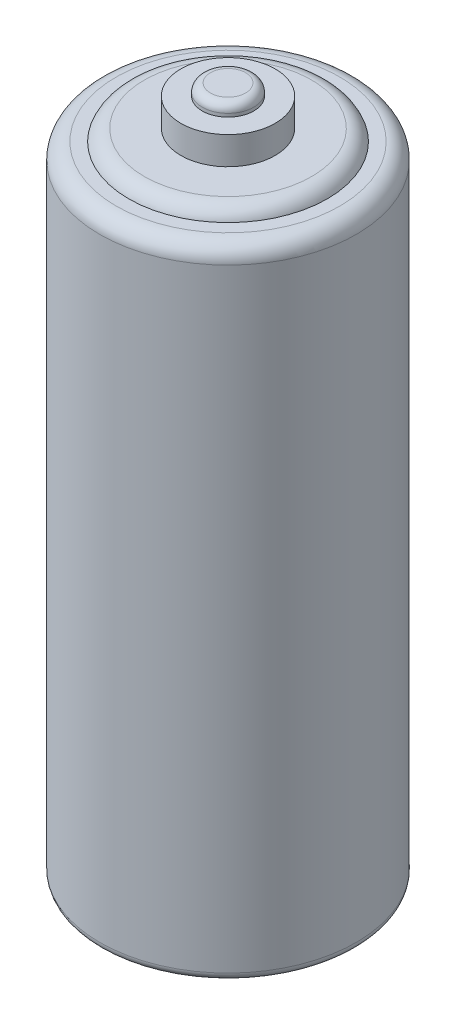
ISO-10303-21;
HEADER;
FILE_DESCRIPTION(('STEP AP214'),'2;1');
FILE_NAME('part.step','',(''),(''),'','','');
FILE_SCHEMA(('AUTOMOTIVE_DESIGN { 1 0 10303 214 1 1 1 1 }'));
ENDSEC;
DATA;
#1=APPLICATION_CONTEXT('core data for automotive mechanical design processes');
#2=APPLICATION_PROTOCOL_DEFINITION('international standard','automotive_design',2000,#1);
#3=PRODUCT_CONTEXT('',#1,'mechanical');
#4=PRODUCT('Part','Part','',(#3));
#5=PRODUCT_RELATED_PRODUCT_CATEGORY('part','',(#4));
#6=PRODUCT_DEFINITION_FORMATION('','',#4);
#7=PRODUCT_DEFINITION_CONTEXT('part definition',#1,'design');
#8=PRODUCT_DEFINITION('design','',#6,#7);
#9=PRODUCT_DEFINITION_SHAPE('','',#8);
#10=(LENGTH_UNIT() NAMED_UNIT(*) SI_UNIT(.MILLI.,.METRE.));
#11=(NAMED_UNIT(*) PLANE_ANGLE_UNIT() SI_UNIT($,.RADIAN.));
#12=(NAMED_UNIT(*) SI_UNIT($,.STERADIAN.) SOLID_ANGLE_UNIT());
#13=UNCERTAINTY_MEASURE_WITH_UNIT(LENGTH_MEASURE(1.E-05),#10,'distance_accuracy_value','');
#14=(GEOMETRIC_REPRESENTATION_CONTEXT(3) GLOBAL_UNCERTAINTY_ASSIGNED_CONTEXT((#13)) GLOBAL_UNIT_ASSIGNED_CONTEXT((#10,
#11,#12)) REPRESENTATION_CONTEXT('',''));
#15=CARTESIAN_POINT('',(0.,0.,0.));
#16=DIRECTION('',(0.,0.,1.));
#17=DIRECTION('',(1.,0.,0.));
#18=AXIS2_PLACEMENT_3D('',#15,#16,#17);
#19=CARTESIAN_POINT('',(-7.36746646919898,38.9,-0.770235130870801));
#20=DIRECTION('',(0.,-1.,0.));
#21=DIRECTION('',(0.,0.,-1.));
#22=AXIS2_PLACEMENT_3D('',#19,#20,#21);
#23=CYLINDRICAL_SURFACE('',#22,7.8222997425254);
#24=CARTESIAN_POINT('',(-7.36746646919898,0.5,-0.770235130870801));
#25=DIRECTION('',(0.,1.,0.));
#26=DIRECTION('',(0.,0.,1.));
#27=AXIS2_PLACEMENT_3D('',#24,#25,#26);
#28=CIRCLE('',#27,7.8222997425254);
#29=CARTESIAN_POINT('',(-7.36746646919898,0.5,7.0520646116546));
#30=VERTEX_POINT('',#29);
#31=EDGE_CURVE('E63',#30,#30,#28,.T.);
#32=ORIENTED_EDGE('',*,*,#31,.T.);
#33=EDGE_LOOP('',(#32));
#34=FACE_BOUND('',#33,.T.);
#35=CARTESIAN_POINT('',(-7.36746646919898,37.9,-0.770235130870801));
#36=DIRECTION('',(0.,1.,0.));
#37=DIRECTION('',(0.,0.,1.));
#38=AXIS2_PLACEMENT_3D('',#35,#36,#37);
#39=CIRCLE('',#38,7.8222997425254);
#40=CARTESIAN_POINT('',(-7.36746646919898,37.9,7.0520646116546));
#41=VERTEX_POINT('',#40);
#42=EDGE_CURVE('E79',#41,#41,#39,.F.);
#43=ORIENTED_EDGE('',*,*,#42,.T.);
#44=EDGE_LOOP('',(#43));
#45=FACE_BOUND('',#44,.T.);
#46=ADVANCED_FACE('F48',(#34,#45),#23,.T.);
#47=CARTESIAN_POINT('',(-7.36746646919898,38.9,-0.770235130870801));
#48=DIRECTION('',(0.,1.,0.));
#49=DIRECTION('',(0.,0.,1.));
#50=AXIS2_PLACEMENT_3D('',#47,#48,#49);
#51=PLANE('',#50);
#52=CARTESIAN_POINT('',(-7.36746646919898,38.9,-0.770235130870801));
#53=DIRECTION('',(0.,1.,0.));
#54=DIRECTION('',(0.,0.,1.));
#55=AXIS2_PLACEMENT_3D('',#52,#53,#54);
#56=CIRCLE('',#55,6.05826995605204);
#57=CARTESIAN_POINT('',(-7.36746646919898,38.9,5.28803482518124));
#58=VERTEX_POINT('',#57);
#59=EDGE_CURVE('E85',#58,#58,#56,.T.);
#60=ORIENTED_EDGE('',*,*,#59,.F.);
#61=EDGE_LOOP('',(#60));
#62=FACE_BOUND('',#61,.T.);
#63=CARTESIAN_POINT('',(-7.36746646919898,38.9,-0.770235130870801));
#64=DIRECTION('',(0.,1.,0.));
#65=DIRECTION('',(0.,0.,1.));
#66=AXIS2_PLACEMENT_3D('',#63,#64,#65);
#67=CIRCLE('',#66,6.8222997425254);
#68=CARTESIAN_POINT('',(-7.36746646919898,38.9,6.0520646116546));
#69=VERTEX_POINT('',#68);
#70=EDGE_CURVE('E82',#69,#69,#67,.T.);
#71=ORIENTED_EDGE('',*,*,#70,.T.);
#72=EDGE_LOOP('',(#71));
#73=FACE_BOUND('',#72,.T.);
#74=ADVANCED_FACE('F121',(#62,#73),#51,.T.);
#75=CARTESIAN_POINT('',(-7.36746646919898,0.,-0.770235130870801));
#76=DIRECTION('',(0.,1.,0.));
#77=DIRECTION('',(0.,0.,1.));
#78=AXIS2_PLACEMENT_3D('',#75,#76,#77);
#79=PLANE('',#78);
#80=CARTESIAN_POINT('',(-7.36746646919898,0.,-0.770235130870801));
#81=DIRECTION('',(0.,1.,0.));
#82=DIRECTION('',(0.,0.,1.));
#83=AXIS2_PLACEMENT_3D('',#80,#81,#82);
#84=CIRCLE('',#83,7.3222997425254);
#85=CARTESIAN_POINT('',(-7.36746646919898,0.,6.5520646116546));
#86=VERTEX_POINT('',#85);
#87=EDGE_CURVE('E59',#86,#86,#84,.F.);
#88=ORIENTED_EDGE('',*,*,#87,.T.);
#89=EDGE_LOOP('',(#88));
#90=FACE_BOUND('',#89,.T.);
#91=CARTESIAN_POINT('',(-7.36746646919898,0.,-0.770235130870801));
#92=DIRECTION('',(0.,-1.,0.));
#93=DIRECTION('',(0.,0.,-1.));
#94=AXIS2_PLACEMENT_3D('',#91,#92,#93);
#95=CIRCLE('',#94,6.61558460102285);
#96=CARTESIAN_POINT('',(-7.36746646919898,0.,-7.38581973189365));
#97=VERTEX_POINT('',#96);
#98=EDGE_CURVE('E68',#97,#97,#95,.T.);
#99=ORIENTED_EDGE('',*,*,#98,.F.);
#100=EDGE_LOOP('',(#99));
#101=FACE_BOUND('',#100,.T.);
#102=ADVANCED_FACE('F127',(#90,#101),#79,.F.);
#103=CARTESIAN_POINT('',(-7.36746646919898,37.9,-0.770235130870801));
#104=DIRECTION('',(0.,1.,0.));
#105=DIRECTION('',(0.,0.,1.));
#106=AXIS2_PLACEMENT_3D('',#103,#104,#105);
#107=TOROIDAL_SURFACE('',#106,6.8222997425254,1.);
#108=ORIENTED_EDGE('',*,*,#42,.F.);
#109=EDGE_LOOP('',(#108));
#110=FACE_BOUND('',#109,.T.);
#111=ORIENTED_EDGE('',*,*,#70,.F.);
#112=EDGE_LOOP('',(#111));
#113=FACE_BOUND('',#112,.T.);
#114=ADVANCED_FACE('F133',(#110,#113),#107,.T.);
#115=CARTESIAN_POINT('',(-7.36746646919898,39.6,-0.770235130870801));
#116=DIRECTION('',(0.,1.,0.));
#117=DIRECTION('',(0.,0.,1.));
#118=AXIS2_PLACEMENT_3D('',#115,#116,#117);
#119=PLANE('',#118);
#120=CARTESIAN_POINT('',(-7.36746646919898,39.6,-0.770235130870801));
#121=DIRECTION('',(0.,1.,0.));
#122=DIRECTION('',(0.,0.,1.));
#123=AXIS2_PLACEMENT_3D('',#120,#121,#122);
#124=CIRCLE('',#123,2.87819941853554);
#125=CARTESIAN_POINT('',(-7.36746646919898,39.6,2.10796428766474));
#126=VERTEX_POINT('',#125);
#127=EDGE_CURVE('E89',#126,#126,#124,.T.);
#128=ORIENTED_EDGE('',*,*,#127,.F.);
#129=EDGE_LOOP('',(#128));
#130=FACE_BOUND('',#129,.T.);
#131=CARTESIAN_POINT('',(-7.36746646919898,39.6,-0.770235130870801));
#132=DIRECTION('',(0.,1.,0.));
#133=DIRECTION('',(0.,0.,1.));
#134=AXIS2_PLACEMENT_3D('',#131,#132,#133);
#135=CIRCLE('',#134,5.1043307546351);
#136=CARTESIAN_POINT('',(-7.36746646919898,39.6,4.3340956237643));
#137=VERTEX_POINT('',#136);
#138=EDGE_CURVE('E76',#137,#137,#135,.T.);
#139=ORIENTED_EDGE('',*,*,#138,.T.);
#140=EDGE_LOOP('',(#139));
#141=FACE_BOUND('',#140,.T.);
#142=ADVANCED_FACE('F136',(#130,#141),#119,.T.);
#143=CARTESIAN_POINT('',(-7.36746646919898,38.6,-0.770235130870801));
#144=DIRECTION('',(0.,-1.,0.));
#145=DIRECTION('',(0.,0.,-1.));
#146=AXIS2_PLACEMENT_3D('',#143,#144,#145);
#147=TOROIDAL_SURFACE('',#146,5.1043307546351,1.);
#148=ORIENTED_EDGE('',*,*,#59,.T.);
#149=EDGE_LOOP('',(#148));
#150=FACE_BOUND('',#149,.T.);
#151=ORIENTED_EDGE('',*,*,#138,.F.);
#152=EDGE_LOOP('',(#151));
#153=FACE_BOUND('',#152,.T.);
#154=ADVANCED_FACE('F138',(#150,#153),#147,.T.);
#155=CARTESIAN_POINT('',(-7.36746646919898,41.3,-0.770235130870801));
#156=DIRECTION('',(0.,-1.,0.));
#157=DIRECTION('',(0.,0.,-1.));
#158=AXIS2_PLACEMENT_3D('',#155,#156,#157);
#159=CYLINDRICAL_SURFACE('',#158,2.87819941853554);
#160=CARTESIAN_POINT('',(-7.36746646919898,41.3,-0.770235130870801));
#161=DIRECTION('',(0.,1.,0.));
#162=DIRECTION('',(0.,0.,1.));
#163=AXIS2_PLACEMENT_3D('',#160,#161,#162);
#164=CIRCLE('',#163,2.87819941853554);
#165=CARTESIAN_POINT('',(-7.36746646919898,41.3,2.10796428766474));
#166=VERTEX_POINT('',#165);
#167=EDGE_CURVE('E88',#166,#166,#164,.T.);
#168=ORIENTED_EDGE('',*,*,#167,.F.);
#169=EDGE_LOOP('',(#168));
#170=FACE_BOUND('',#169,.T.);
#171=ORIENTED_EDGE('',*,*,#127,.T.);
#172=EDGE_LOOP('',(#171));
#173=FACE_BOUND('',#172,.T.);
#174=ADVANCED_FACE('F140',(#170,#173),#159,.T.);
#175=CARTESIAN_POINT('',(-7.36746646919898,41.3,-0.770235130870801));
#176=DIRECTION('',(0.,1.,0.));
#177=DIRECTION('',(0.,0.,1.));
#178=AXIS2_PLACEMENT_3D('',#175,#176,#177);
#179=PLANE('',#178);
#180=CARTESIAN_POINT('',(-7.36746646919898,41.3,-0.770235130870801));
#181=DIRECTION('',(0.,1.,0.));
#182=DIRECTION('',(0.,0.,1.));
#183=AXIS2_PLACEMENT_3D('',#180,#181,#182);
#184=CIRCLE('',#183,1.57347679038986);
#185=CARTESIAN_POINT('',(-7.36746646919898,41.3,0.803241659519061));
#186=VERTEX_POINT('',#185);
#187=EDGE_CURVE('E75',#186,#186,#184,.T.);
#188=ORIENTED_EDGE('',*,*,#187,.F.);
#189=EDGE_LOOP('',(#188));
#190=FACE_BOUND('',#189,.T.);
#191=ORIENTED_EDGE('',*,*,#167,.T.);
#192=EDGE_LOOP('',(#191));
#193=FACE_BOUND('',#192,.T.);
#194=ADVANCED_FACE('F170',(#190,#193),#179,.T.);
#195=CARTESIAN_POINT('',(-7.36746646919898,42.,-0.770235130870801));
#196=DIRECTION('',(0.,-1.,0.));
#197=DIRECTION('',(0.,0.,-1.));
#198=AXIS2_PLACEMENT_3D('',#195,#196,#197);
#199=CYLINDRICAL_SURFACE('',#198,1.57347679038986);
#200=CARTESIAN_POINT('',(-7.36746646919898,41.5,-0.770235130870801));
#201=DIRECTION('',(0.,1.,0.));
#202=DIRECTION('',(0.,0.,1.));
#203=AXIS2_PLACEMENT_3D('',#200,#201,#202);
#204=CIRCLE('',#203,1.57347679038986);
#205=CARTESIAN_POINT('',(-7.36746646919898,41.5,0.803241659519061));
#206=VERTEX_POINT('',#205);
#207=EDGE_CURVE('E69',#206,#206,#204,.F.);
#208=ORIENTED_EDGE('',*,*,#207,.T.);
#209=EDGE_LOOP('',(#208));
#210=FACE_BOUND('',#209,.T.);
#211=ORIENTED_EDGE('',*,*,#187,.T.);
#212=EDGE_LOOP('',(#211));
#213=FACE_BOUND('',#212,.T.);
#214=ADVANCED_FACE('F176',(#210,#213),#199,.T.);
#215=CARTESIAN_POINT('',(-7.36746646919898,42.,-0.770235130870801));
#216=DIRECTION('',(0.,1.,0.));
#217=DIRECTION('',(0.,0.,1.));
#218=AXIS2_PLACEMENT_3D('',#215,#216,#217);
#219=PLANE('',#218);
#220=CARTESIAN_POINT('',(-7.36746646919898,42.,-0.770235130870801));
#221=DIRECTION('',(0.,1.,0.));
#222=DIRECTION('',(0.,0.,1.));
#223=AXIS2_PLACEMENT_3D('',#220,#221,#222);
#224=CIRCLE('',#223,1.07347679038986);
#225=CARTESIAN_POINT('',(-7.36746646919898,42.,0.303241659519061));
#226=VERTEX_POINT('',#225);
#227=EDGE_CURVE('E72',#226,#226,#224,.T.);
#228=ORIENTED_EDGE('',*,*,#227,.T.);
#229=EDGE_LOOP('',(#228));
#230=FACE_BOUND('',#229,.T.);
#231=ADVANCED_FACE('F115',(#230),#219,.T.);
#232=CARTESIAN_POINT('',(-7.36746646919898,41.5,-0.770235130870801));
#233=DIRECTION('',(0.,1.,0.));
#234=DIRECTION('',(0.,0.,1.));
#235=AXIS2_PLACEMENT_3D('',#232,#233,#234);
#236=TOROIDAL_SURFACE('',#235,1.07347679038986,0.5);
#237=ORIENTED_EDGE('',*,*,#207,.F.);
#238=EDGE_LOOP('',(#237));
#239=FACE_BOUND('',#238,.T.);
#240=ORIENTED_EDGE('',*,*,#227,.F.);
#241=EDGE_LOOP('',(#240));
#242=FACE_BOUND('',#241,.T.);
#243=ADVANCED_FACE('F107',(#239,#242),#236,.T.);
#244=CARTESIAN_POINT('',(-7.36746646919898,-0.2,-0.770235130870801));
#245=DIRECTION('',(0.,-1.,0.));
#246=DIRECTION('',(0.,0.,-1.));
#247=AXIS2_PLACEMENT_3D('',#244,#245,#246);
#248=PLANE('',#247);
#249=CARTESIAN_POINT('',(-7.36746646919898,-0.2,-0.770235130870801));
#250=DIRECTION('',(0.,-1.,0.));
#251=DIRECTION('',(0.,0.,-1.));
#252=AXIS2_PLACEMENT_3D('',#249,#250,#251);
#253=CIRCLE('',#252,5.40353048940174);
#254=CARTESIAN_POINT('',(-7.36746646919898,-0.2,-6.17376562027254));
#255=VERTEX_POINT('',#254);
#256=EDGE_CURVE('E92',#255,#255,#253,.T.);
#257=ORIENTED_EDGE('',*,*,#256,.F.);
#258=EDGE_LOOP('',(#257));
#259=FACE_BOUND('',#258,.T.);
#260=CARTESIAN_POINT('',(-7.36746646919898,-0.2,-0.770235130870801));
#261=DIRECTION('',(0.,-1.,0.));
#262=DIRECTION('',(0.,0.,-1.));
#263=AXIS2_PLACEMENT_3D('',#260,#261,#262);
#264=CIRCLE('',#263,6.21558460102285);
#265=CARTESIAN_POINT('',(-7.36746646919898,-0.2,-6.98581973189365));
#266=VERTEX_POINT('',#265);
#267=EDGE_CURVE('E55',#266,#266,#264,.T.);
#268=ORIENTED_EDGE('',*,*,#267,.T.);
#269=EDGE_LOOP('',(#268));
#270=FACE_BOUND('',#269,.T.);
#271=ADVANCED_FACE('F104',(#259,#270),#248,.T.);
#272=CARTESIAN_POINT('',(-7.36746646919898,0.5,-0.770235130870801));
#273=DIRECTION('',(0.,1.,0.));
#274=DIRECTION('',(0.,0.,1.));
#275=AXIS2_PLACEMENT_3D('',#272,#273,#274);
#276=TOROIDAL_SURFACE('',#275,7.3222997425254,0.5);
#277=ORIENTED_EDGE('',*,*,#87,.F.);
#278=EDGE_LOOP('',(#277));
#279=FACE_BOUND('',#278,.T.);
#280=ORIENTED_EDGE('',*,*,#31,.F.);
#281=EDGE_LOOP('',(#280));
#282=FACE_BOUND('',#281,.T.);
#283=ADVANCED_FACE('F106',(#279,#282),#276,.T.);
#284=CARTESIAN_POINT('',(-7.36746646919898,0.3,-0.770235130870801));
#285=DIRECTION('',(0.,1.,0.));
#286=DIRECTION('',(0.,0.,1.));
#287=AXIS2_PLACEMENT_3D('',#284,#285,#286);
#288=TOROIDAL_SURFACE('',#287,6.21558460102285,0.5);
#289=ORIENTED_EDGE('',*,*,#98,.T.);
#290=EDGE_LOOP('',(#289));
#291=FACE_BOUND('',#290,.T.);
#292=ORIENTED_EDGE('',*,*,#267,.F.);
#293=EDGE_LOOP('',(#292));
#294=FACE_BOUND('',#293,.T.);
#295=ADVANCED_FACE('F112',(#291,#294),#288,.T.);
#296=CARTESIAN_POINT('',(-7.36746646919898,-0.4,-0.770235130870801));
#297=DIRECTION('',(0.,-1.,0.));
#298=DIRECTION('',(0.,0.,-1.));
#299=AXIS2_PLACEMENT_3D('',#296,#297,#298);
#300=PLANE('',#299);
#301=CARTESIAN_POINT('',(-7.36746646919898,-0.4,-0.770235130870801));
#302=DIRECTION('',(0.,-1.,0.));
#303=DIRECTION('',(0.,0.,-1.));
#304=AXIS2_PLACEMENT_3D('',#301,#302,#303);
#305=CIRCLE('',#304,5.00353048940174);
#306=CARTESIAN_POINT('',(-7.36746646919898,-0.4,-5.77376562027255));
#307=VERTEX_POINT('',#306);
#308=EDGE_CURVE('E12',#307,#307,#305,.T.);
#309=ORIENTED_EDGE('',*,*,#308,.T.);
#310=EDGE_LOOP('',(#309));
#311=FACE_BOUND('',#310,.T.);
#312=ADVANCED_FACE('F143',(#311),#300,.T.);
#313=CARTESIAN_POINT('',(-7.36746646919898,0.1,-0.770235130870801));
#314=DIRECTION('',(0.,1.,0.));
#315=DIRECTION('',(0.,0.,1.));
#316=AXIS2_PLACEMENT_3D('',#313,#314,#315);
#317=TOROIDAL_SURFACE('',#316,5.00353048940174,0.5);
#318=ORIENTED_EDGE('',*,*,#256,.T.);
#319=EDGE_LOOP('',(#318));
#320=FACE_BOUND('',#319,.T.);
#321=ORIENTED_EDGE('',*,*,#308,.F.);
#322=EDGE_LOOP('',(#321));
#323=FACE_BOUND('',#322,.T.);
#324=ADVANCED_FACE('F50',(#320,#323),#317,.T.);
#325=CLOSED_SHELL('',(#46,#74,#102,#114,#142,#154,#174,#194,#214,#231,#243,#271,#283,#295,#312,#324));
#326=MANIFOLD_SOLID_BREP('B2',#325);
#327=ADVANCED_BREP_SHAPE_REPRESENTATION('',(#18,#326),#14);
#328=SHAPE_DEFINITION_REPRESENTATION(#9,#327);
ENDSEC;
END-ISO-10303-21;
